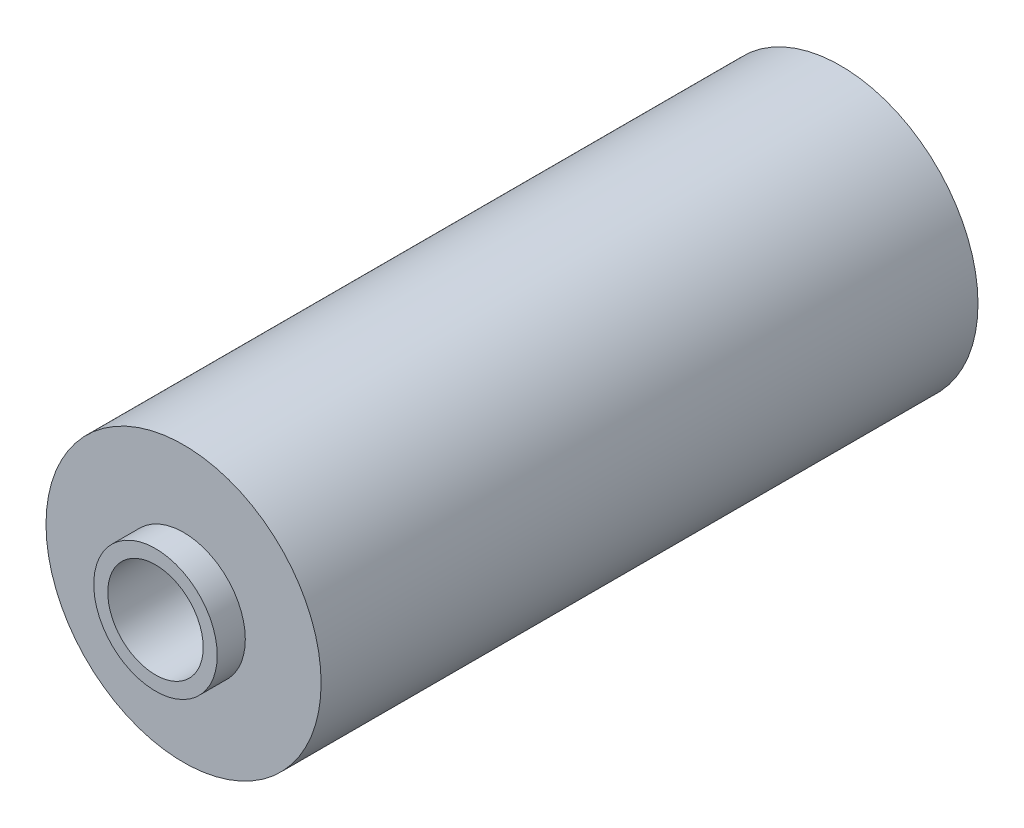
ISO-10303-21;
HEADER;
FILE_DESCRIPTION(('STEP AP214'),'2;1');
FILE_NAME('part.step','',(''),(''),'','','');
FILE_SCHEMA(('AUTOMOTIVE_DESIGN { 1 0 10303 214 1 1 1 1 }'));
ENDSEC;
DATA;
#1=APPLICATION_CONTEXT('core data for automotive mechanical design processes');
#2=APPLICATION_PROTOCOL_DEFINITION('international standard','automotive_design',2000,#1);
#3=PRODUCT_CONTEXT('',#1,'mechanical');
#4=PRODUCT('Part','Part','',(#3));
#5=PRODUCT_RELATED_PRODUCT_CATEGORY('part','',(#4));
#6=PRODUCT_DEFINITION_FORMATION('','',#4);
#7=PRODUCT_DEFINITION_CONTEXT('part definition',#1,'design');
#8=PRODUCT_DEFINITION('design','',#6,#7);
#9=PRODUCT_DEFINITION_SHAPE('','',#8);
#10=(LENGTH_UNIT() NAMED_UNIT(*) SI_UNIT(.MILLI.,.METRE.));
#11=(NAMED_UNIT(*) PLANE_ANGLE_UNIT() SI_UNIT($,.RADIAN.));
#12=(NAMED_UNIT(*) SI_UNIT($,.STERADIAN.) SOLID_ANGLE_UNIT());
#13=UNCERTAINTY_MEASURE_WITH_UNIT(LENGTH_MEASURE(1.E-05),#10,'distance_accuracy_value','');
#14=(GEOMETRIC_REPRESENTATION_CONTEXT(3) GLOBAL_UNCERTAINTY_ASSIGNED_CONTEXT((#13)) GLOBAL_UNIT_ASSIGNED_CONTEXT((#10,
#11,#12)) REPRESENTATION_CONTEXT('',''));
#15=CARTESIAN_POINT('',(0.,0.,0.));
#16=DIRECTION('',(0.,0.,1.));
#17=DIRECTION('',(1.,0.,0.));
#18=AXIS2_PLACEMENT_3D('',#15,#16,#17);
#19=CARTESIAN_POINT('',(0.,0.,23.4));
#20=DIRECTION('',(0.,0.,1.));
#21=DIRECTION('',(1.,0.,0.));
#22=AXIS2_PLACEMENT_3D('',#19,#20,#21);
#23=PLANE('',#22);
#24=CARTESIAN_POINT('',(0.,0.,23.4));
#25=DIRECTION('',(0.,0.,1.));
#26=DIRECTION('',(1.,0.,0.));
#27=AXIS2_PLACEMENT_3D('',#24,#25,#26);
#28=CIRCLE('',#27,4.9);
#29=CARTESIAN_POINT('',(4.9,0.,23.4));
#30=VERTEX_POINT('',#29);
#31=EDGE_CURVE('E10',#30,#30,#28,.T.);
#32=ORIENTED_EDGE('',*,*,#31,.T.);
#33=EDGE_LOOP('',(#32));
#34=FACE_BOUND('',#33,.T.);
#35=CARTESIAN_POINT('',(0.,0.,23.4));
#36=DIRECTION('',(0.,0.,1.));
#37=DIRECTION('',(1.,0.,0.));
#38=AXIS2_PLACEMENT_3D('',#35,#36,#37);
#39=CIRCLE('',#38,2.2);
#40=CARTESIAN_POINT('',(2.2,0.,23.4));
#41=VERTEX_POINT('',#40);
#42=EDGE_CURVE('E56',#41,#41,#39,.T.);
#43=ORIENTED_EDGE('',*,*,#42,.F.);
#44=EDGE_LOOP('',(#43));
#45=FACE_BOUND('',#44,.T.);
#46=ADVANCED_FACE('F37',(#34,#45),#23,.T.);
#47=CARTESIAN_POINT('',(0.,0.,0.));
#48=DIRECTION('',(0.,0.,1.));
#49=DIRECTION('',(1.,0.,0.));
#50=AXIS2_PLACEMENT_3D('',#47,#48,#49);
#51=PLANE('',#50);
#52=CARTESIAN_POINT('',(0.,0.,0.));
#53=DIRECTION('',(0.,0.,1.));
#54=DIRECTION('',(1.,0.,0.));
#55=AXIS2_PLACEMENT_3D('',#52,#53,#54);
#56=CIRCLE('',#55,4.9);
#57=CARTESIAN_POINT('',(4.9,0.,0.));
#58=VERTEX_POINT('',#57);
#59=EDGE_CURVE('E41',#58,#58,#56,.T.);
#60=ORIENTED_EDGE('',*,*,#59,.F.);
#61=EDGE_LOOP('',(#60));
#62=FACE_BOUND('',#61,.T.);
#63=CARTESIAN_POINT('',(0.,0.,0.));
#64=DIRECTION('',(0.,0.,1.));
#65=DIRECTION('',(1.,0.,0.));
#66=AXIS2_PLACEMENT_3D('',#63,#64,#65);
#67=CIRCLE('',#66,1.7);
#68=CARTESIAN_POINT('',(1.7,0.,0.));
#69=VERTEX_POINT('',#68);
#70=EDGE_CURVE('E50',#69,#69,#67,.T.);
#71=ORIENTED_EDGE('',*,*,#70,.T.);
#72=EDGE_LOOP('',(#71));
#73=FACE_BOUND('',#72,.T.);
#74=ADVANCED_FACE('F84',(#62,#73),#51,.F.);
#75=CARTESIAN_POINT('',(0.,0.,23.4));
#76=DIRECTION('',(0.,0.,-1.));
#77=DIRECTION('',(-1.,0.,0.));
#78=AXIS2_PLACEMENT_3D('',#75,#76,#77);
#79=CYLINDRICAL_SURFACE('',#78,4.9);
#80=ORIENTED_EDGE('',*,*,#31,.F.);
#81=EDGE_LOOP('',(#80));
#82=FACE_BOUND('',#81,.T.);
#83=ORIENTED_EDGE('',*,*,#59,.T.);
#84=EDGE_LOOP('',(#83));
#85=FACE_BOUND('',#84,.T.);
#86=ADVANCED_FACE('F39',(#82,#85),#79,.T.);
#87=CARTESIAN_POINT('',(0.,0.,23.4));
#88=DIRECTION('',(0.,0.,-1.));
#89=DIRECTION('',(-1.,0.,0.));
#90=AXIS2_PLACEMENT_3D('',#87,#88,#89);
#91=CYLINDRICAL_SURFACE('',#90,1.7);
#92=ORIENTED_EDGE('',*,*,#70,.F.);
#93=EDGE_LOOP('',(#92));
#94=FACE_BOUND('',#93,.T.);
#95=CARTESIAN_POINT('',(0.,0.,24.4));
#96=DIRECTION('',(0.,0.,1.));
#97=DIRECTION('',(1.,0.,0.));
#98=AXIS2_PLACEMENT_3D('',#95,#96,#97);
#99=CIRCLE('',#98,1.7);
#100=CARTESIAN_POINT('',(1.7,0.,24.4));
#101=VERTEX_POINT('',#100);
#102=EDGE_CURVE('E60',#101,#101,#99,.T.);
#103=ORIENTED_EDGE('',*,*,#102,.T.);
#104=EDGE_LOOP('',(#103));
#105=FACE_BOUND('',#104,.T.);
#106=ADVANCED_FACE('F68',(#94,#105),#91,.F.);
#107=CARTESIAN_POINT('',(0.,0.,24.4));
#108=DIRECTION('',(0.,0.,1.));
#109=DIRECTION('',(1.,0.,0.));
#110=AXIS2_PLACEMENT_3D('',#107,#108,#109);
#111=PLANE('',#110);
#112=CARTESIAN_POINT('',(0.,0.,24.4));
#113=DIRECTION('',(0.,0.,1.));
#114=DIRECTION('',(1.,0.,0.));
#115=AXIS2_PLACEMENT_3D('',#112,#113,#114);
#116=CIRCLE('',#115,2.2);
#117=CARTESIAN_POINT('',(2.2,0.,24.4));
#118=VERTEX_POINT('',#117);
#119=EDGE_CURVE('E55',#118,#118,#116,.T.);
#120=ORIENTED_EDGE('',*,*,#119,.T.);
#121=EDGE_LOOP('',(#120));
#122=FACE_BOUND('',#121,.T.);
#123=ORIENTED_EDGE('',*,*,#102,.F.);
#124=EDGE_LOOP('',(#123));
#125=FACE_BOUND('',#124,.T.);
#126=ADVANCED_FACE('F70',(#122,#125),#111,.T.);
#127=CARTESIAN_POINT('',(0.,0.,24.4));
#128=DIRECTION('',(0.,0.,-1.));
#129=DIRECTION('',(-1.,0.,0.));
#130=AXIS2_PLACEMENT_3D('',#127,#128,#129);
#131=CYLINDRICAL_SURFACE('',#130,2.2);
#132=ORIENTED_EDGE('',*,*,#119,.F.);
#133=EDGE_LOOP('',(#132));
#134=FACE_BOUND('',#133,.T.);
#135=ORIENTED_EDGE('',*,*,#42,.T.);
#136=EDGE_LOOP('',(#135));
#137=FACE_BOUND('',#136,.T.);
#138=ADVANCED_FACE('F72',(#134,#137),#131,.T.);
#139=CLOSED_SHELL('',(#46,#74,#86,#106,#126,#138));
#140=MANIFOLD_SOLID_BREP('B2',#139);
#141=ADVANCED_BREP_SHAPE_REPRESENTATION('',(#18,#140),#14);
#142=SHAPE_DEFINITION_REPRESENTATION(#9,#141);
ENDSEC;
END-ISO-10303-21;
